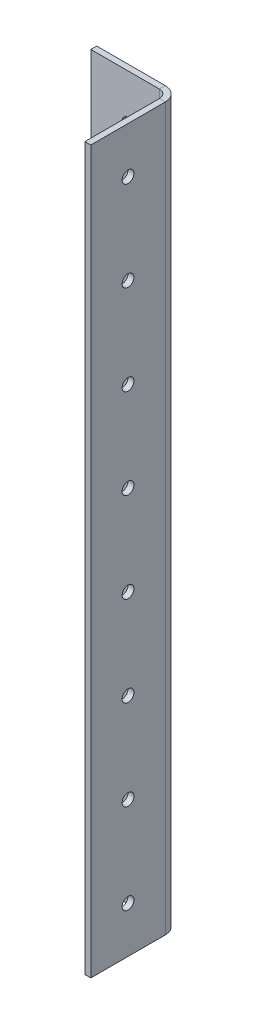
ISO-10303-21;
HEADER;
FILE_DESCRIPTION(('STEP AP214'),'2;1');
FILE_NAME('part.step','',(''),(''),'','','');
FILE_SCHEMA(('AUTOMOTIVE_DESIGN { 1 0 10303 214 1 1 1 1 }'));
ENDSEC;
DATA;
#1=APPLICATION_CONTEXT('core data for automotive mechanical design processes');
#2=APPLICATION_PROTOCOL_DEFINITION('international standard','automotive_design',2000,#1);
#3=PRODUCT_CONTEXT('',#1,'mechanical');
#4=PRODUCT('Part','Part','',(#3));
#5=PRODUCT_RELATED_PRODUCT_CATEGORY('part','',(#4));
#6=PRODUCT_DEFINITION_FORMATION('','',#4);
#7=PRODUCT_DEFINITION_CONTEXT('part definition',#1,'design');
#8=PRODUCT_DEFINITION('design','',#6,#7);
#9=PRODUCT_DEFINITION_SHAPE('','',#8);
#10=(LENGTH_UNIT() NAMED_UNIT(*) SI_UNIT(.MILLI.,.METRE.));
#11=(NAMED_UNIT(*) PLANE_ANGLE_UNIT() SI_UNIT($,.RADIAN.));
#12=(NAMED_UNIT(*) SI_UNIT($,.STERADIAN.) SOLID_ANGLE_UNIT());
#13=UNCERTAINTY_MEASURE_WITH_UNIT(LENGTH_MEASURE(1.E-05),#10,'distance_accuracy_value','');
#14=(GEOMETRIC_REPRESENTATION_CONTEXT(3) GLOBAL_UNCERTAINTY_ASSIGNED_CONTEXT((#13)) GLOBAL_UNIT_ASSIGNED_CONTEXT((#10,
#11,#12)) REPRESENTATION_CONTEXT('',''));
#15=CARTESIAN_POINT('',(0.,0.,0.));
#16=DIRECTION('',(0.,0.,1.));
#17=DIRECTION('',(1.,0.,0.));
#18=AXIS2_PLACEMENT_3D('',#15,#16,#17);
#19=CARTESIAN_POINT('',(-70.,610.,-10.));
#20=DIRECTION('',(0.,1.,0.));
#21=DIRECTION('',(0.,0.,1.));
#22=AXIS2_PLACEMENT_3D('',#19,#20,#21);
#23=PLANE('',#22);
#24=DIRECTION('',(-1.,0.,0.));
#25=VECTOR('',#24,1.);
#26=CARTESIAN_POINT('',(-70.,610.,0.));
#27=LINE('',#26,#25);
#28=CARTESIAN_POINT('',(46.0000000000001,610.,0.));
#29=VERTEX_POINT('',#28);
#30=CARTESIAN_POINT('',(-70.,610.,0.));
#31=VERTEX_POINT('',#30);
#32=EDGE_CURVE('E109',#29,#31,#27,.T.);
#33=ORIENTED_EDGE('',*,*,#32,.F.);
#34=DIRECTION('',(0.,0.,-1.));
#35=VECTOR('',#34,1.);
#36=CARTESIAN_POINT('',(46.0000000000001,610.,0.));
#37=LINE('',#36,#35);
#38=CARTESIAN_POINT('',(46.0000000000001,610.,-10.));
#39=VERTEX_POINT('',#38);
#40=EDGE_CURVE('E129',#29,#39,#37,.T.);
#41=ORIENTED_EDGE('',*,*,#40,.T.);
#42=DIRECTION('',(-1.,0.,0.));
#43=VECTOR('',#42,1.);
#44=CARTESIAN_POINT('',(-70.,610.,-10.));
#45=LINE('',#44,#43);
#46=CARTESIAN_POINT('',(-70.,610.,-10.));
#47=VERTEX_POINT('',#46);
#48=EDGE_CURVE('E116',#39,#47,#45,.T.);
#49=ORIENTED_EDGE('',*,*,#48,.T.);
#50=DIRECTION('',(0.,0.,1.));
#51=VECTOR('',#50,1.);
#52=CARTESIAN_POINT('',(-70.,610.,-10.));
#53=LINE('',#52,#51);
#54=EDGE_CURVE('E63',#47,#31,#53,.T.);
#55=ORIENTED_EDGE('',*,*,#54,.T.);
#56=EDGE_LOOP('',(#33,#41,#49,#55));
#57=FACE_BOUND('',#56,.T.);
#58=ADVANCED_FACE('F60',(#57),#23,.T.);
#59=CARTESIAN_POINT('',(0.,0.,-10.));
#60=DIRECTION('',(0.,0.,-1.));
#61=DIRECTION('',(-1.,0.,0.));
#62=AXIS2_PLACEMENT_3D('',#59,#60,#61);
#63=PLANE('',#62);
#64=CARTESIAN_POINT('',(-7.00000000000001,380.,-10.));
#65=DIRECTION('',(0.,0.,1.));
#66=DIRECTION('',(1.,0.,0.));
#67=AXIS2_PLACEMENT_3D('',#64,#65,#66);
#68=CIRCLE('',#67,10.);
#69=CARTESIAN_POINT('',(3.00000000000001,380.,-10.));
#70=VERTEX_POINT('',#69);
#71=EDGE_CURVE('E230',#70,#70,#68,.T.);
#72=ORIENTED_EDGE('',*,*,#71,.T.);
#73=EDGE_LOOP('',(#72));
#74=FACE_BOUND('',#73,.T.);
#75=CARTESIAN_POINT('',(-7.00000000000001,228.,-10.));
#76=DIRECTION('',(0.,0.,1.));
#77=DIRECTION('',(1.,0.,0.));
#78=AXIS2_PLACEMENT_3D('',#75,#76,#77);
#79=CIRCLE('',#78,10.);
#80=CARTESIAN_POINT('',(3.00000000000001,228.,-10.));
#81=VERTEX_POINT('',#80);
#82=EDGE_CURVE('E321',#81,#81,#79,.T.);
#83=ORIENTED_EDGE('',*,*,#82,.T.);
#84=EDGE_LOOP('',(#83));
#85=FACE_BOUND('',#84,.T.);
#86=CARTESIAN_POINT('',(-7.00000000000001,76.,-10.));
#87=DIRECTION('',(0.,0.,1.));
#88=DIRECTION('',(1.,0.,0.));
#89=AXIS2_PLACEMENT_3D('',#86,#87,#88);
#90=CIRCLE('',#89,10.);
#91=CARTESIAN_POINT('',(3.00000000000001,76.,-10.));
#92=VERTEX_POINT('',#91);
#93=EDGE_CURVE('E313',#92,#92,#90,.T.);
#94=ORIENTED_EDGE('',*,*,#93,.T.);
#95=EDGE_LOOP('',(#94));
#96=FACE_BOUND('',#95,.T.);
#97=CARTESIAN_POINT('',(-7.00000000000001,-76.0000000000001,-10.));
#98=DIRECTION('',(0.,0.,1.));
#99=DIRECTION('',(1.,0.,0.));
#100=AXIS2_PLACEMENT_3D('',#97,#98,#99);
#101=CIRCLE('',#100,10.);
#102=CARTESIAN_POINT('',(3.00000000000001,-76.0000000000001,-10.));
#103=VERTEX_POINT('',#102);
#104=EDGE_CURVE('E305',#103,#103,#101,.T.);
#105=ORIENTED_EDGE('',*,*,#104,.T.);
#106=EDGE_LOOP('',(#105));
#107=FACE_BOUND('',#106,.T.);
#108=CARTESIAN_POINT('',(-7.00000000000001,-228.,-10.));
#109=DIRECTION('',(0.,0.,1.));
#110=DIRECTION('',(1.,0.,0.));
#111=AXIS2_PLACEMENT_3D('',#108,#109,#110);
#112=CIRCLE('',#111,10.);
#113=CARTESIAN_POINT('',(3.00000000000001,-228.,-10.));
#114=VERTEX_POINT('',#113);
#115=EDGE_CURVE('E297',#114,#114,#112,.T.);
#116=ORIENTED_EDGE('',*,*,#115,.T.);
#117=EDGE_LOOP('',(#116));
#118=FACE_BOUND('',#117,.T.);
#119=CARTESIAN_POINT('',(-7.00000000000001,-380.,-10.));
#120=DIRECTION('',(0.,0.,1.));
#121=DIRECTION('',(1.,0.,0.));
#122=AXIS2_PLACEMENT_3D('',#119,#120,#121);
#123=CIRCLE('',#122,10.);
#124=CARTESIAN_POINT('',(3.00000000000001,-380.,-10.));
#125=VERTEX_POINT('',#124);
#126=EDGE_CURVE('E289',#125,#125,#123,.T.);
#127=ORIENTED_EDGE('',*,*,#126,.T.);
#128=EDGE_LOOP('',(#127));
#129=FACE_BOUND('',#128,.T.);
#130=CARTESIAN_POINT('',(-7.00000000000001,-532.,-10.));
#131=DIRECTION('',(0.,0.,1.));
#132=DIRECTION('',(1.,0.,0.));
#133=AXIS2_PLACEMENT_3D('',#130,#131,#132);
#134=CIRCLE('',#133,10.);
#135=CARTESIAN_POINT('',(3.00000000000001,-532.,-10.));
#136=VERTEX_POINT('',#135);
#137=EDGE_CURVE('E281',#136,#136,#134,.T.);
#138=ORIENTED_EDGE('',*,*,#137,.T.);
#139=EDGE_LOOP('',(#138));
#140=FACE_BOUND('',#139,.T.);
#141=CARTESIAN_POINT('',(-7.00000000000001,532.,-10.));
#142=DIRECTION('',(0.,0.,1.));
#143=DIRECTION('',(1.,0.,0.));
#144=AXIS2_PLACEMENT_3D('',#141,#142,#143);
#145=CIRCLE('',#144,10.);
#146=CARTESIAN_POINT('',(3.00000000000001,532.,-10.));
#147=VERTEX_POINT('',#146);
#148=EDGE_CURVE('E209',#147,#147,#145,.T.);
#149=ORIENTED_EDGE('',*,*,#148,.T.);
#150=EDGE_LOOP('',(#149));
#151=FACE_BOUND('',#150,.T.);
#152=ORIENTED_EDGE('',*,*,#48,.F.);
#153=DIRECTION('',(0.,1.,0.));
#154=VECTOR('',#153,1.);
#155=CARTESIAN_POINT('',(46.0000000000001,610.,-10.));
#156=LINE('',#155,#154);
#157=CARTESIAN_POINT('',(46.0000000000001,-610.,-10.));
#158=VERTEX_POINT('',#157);
#159=EDGE_CURVE('E152',#39,#158,#156,.F.);
#160=ORIENTED_EDGE('',*,*,#159,.T.);
#161=DIRECTION('',(1.,0.,0.));
#162=VECTOR('',#161,1.);
#163=CARTESIAN_POINT('',(-70.,-610.,-10.));
#164=LINE('',#163,#162);
#165=CARTESIAN_POINT('',(-70.,-610.,-10.));
#166=VERTEX_POINT('',#165);
#167=EDGE_CURVE('E124',#166,#158,#164,.T.);
#168=ORIENTED_EDGE('',*,*,#167,.F.);
#169=DIRECTION('',(0.,-1.,0.));
#170=VECTOR('',#169,1.);
#171=CARTESIAN_POINT('',(-70.,-610.,-10.));
#172=LINE('',#171,#170);
#173=EDGE_CURVE('E99',#47,#166,#172,.T.);
#174=ORIENTED_EDGE('',*,*,#173,.F.);
#175=EDGE_LOOP('',(#152,#160,#168,#174));
#176=FACE_BOUND('',#175,.T.);
#177=ADVANCED_FACE('F334',(#74,#85,#96,#107,#118,#129,#140,#151,#176),#63,.T.);
#178=CARTESIAN_POINT('',(0.,0.,0.));
#179=DIRECTION('',(0.,0.,-1.));
#180=DIRECTION('',(-1.,0.,0.));
#181=AXIS2_PLACEMENT_3D('',#178,#179,#180);
#182=PLANE('',#181);
#183=CARTESIAN_POINT('',(-7.00000000000001,380.,0.));
#184=DIRECTION('',(0.,0.,1.));
#185=DIRECTION('',(1.,0.,0.));
#186=AXIS2_PLACEMENT_3D('',#183,#184,#185);
#187=CIRCLE('',#186,10.);
#188=CARTESIAN_POINT('',(3.00000000000001,380.,0.));
#189=VERTEX_POINT('',#188);
#190=EDGE_CURVE('E325',#189,#189,#187,.T.);
#191=ORIENTED_EDGE('',*,*,#190,.F.);
#192=EDGE_LOOP('',(#191));
#193=FACE_BOUND('',#192,.T.);
#194=CARTESIAN_POINT('',(-7.00000000000001,228.,0.));
#195=DIRECTION('',(0.,0.,1.));
#196=DIRECTION('',(1.,0.,0.));
#197=AXIS2_PLACEMENT_3D('',#194,#195,#196);
#198=CIRCLE('',#197,10.);
#199=CARTESIAN_POINT('',(3.00000000000001,228.,0.));
#200=VERTEX_POINT('',#199);
#201=EDGE_CURVE('E317',#200,#200,#198,.T.);
#202=ORIENTED_EDGE('',*,*,#201,.F.);
#203=EDGE_LOOP('',(#202));
#204=FACE_BOUND('',#203,.T.);
#205=CARTESIAN_POINT('',(-7.00000000000001,76.,0.));
#206=DIRECTION('',(0.,0.,1.));
#207=DIRECTION('',(1.,0.,0.));
#208=AXIS2_PLACEMENT_3D('',#205,#206,#207);
#209=CIRCLE('',#208,10.);
#210=CARTESIAN_POINT('',(3.00000000000001,76.,0.));
#211=VERTEX_POINT('',#210);
#212=EDGE_CURVE('E309',#211,#211,#209,.T.);
#213=ORIENTED_EDGE('',*,*,#212,.F.);
#214=EDGE_LOOP('',(#213));
#215=FACE_BOUND('',#214,.T.);
#216=CARTESIAN_POINT('',(-7.00000000000001,-76.0000000000001,0.));
#217=DIRECTION('',(0.,0.,1.));
#218=DIRECTION('',(1.,0.,0.));
#219=AXIS2_PLACEMENT_3D('',#216,#217,#218);
#220=CIRCLE('',#219,10.);
#221=CARTESIAN_POINT('',(3.00000000000001,-76.0000000000001,0.));
#222=VERTEX_POINT('',#221);
#223=EDGE_CURVE('E301',#222,#222,#220,.T.);
#224=ORIENTED_EDGE('',*,*,#223,.F.);
#225=EDGE_LOOP('',(#224));
#226=FACE_BOUND('',#225,.T.);
#227=CARTESIAN_POINT('',(-7.00000000000001,-228.,0.));
#228=DIRECTION('',(0.,0.,1.));
#229=DIRECTION('',(1.,0.,0.));
#230=AXIS2_PLACEMENT_3D('',#227,#228,#229);
#231=CIRCLE('',#230,10.);
#232=CARTESIAN_POINT('',(3.00000000000001,-228.,0.));
#233=VERTEX_POINT('',#232);
#234=EDGE_CURVE('E293',#233,#233,#231,.T.);
#235=ORIENTED_EDGE('',*,*,#234,.F.);
#236=EDGE_LOOP('',(#235));
#237=FACE_BOUND('',#236,.T.);
#238=CARTESIAN_POINT('',(-7.00000000000001,-380.,0.));
#239=DIRECTION('',(0.,0.,1.));
#240=DIRECTION('',(1.,0.,0.));
#241=AXIS2_PLACEMENT_3D('',#238,#239,#240);
#242=CIRCLE('',#241,10.);
#243=CARTESIAN_POINT('',(3.00000000000001,-380.,0.));
#244=VERTEX_POINT('',#243);
#245=EDGE_CURVE('E285',#244,#244,#242,.T.);
#246=ORIENTED_EDGE('',*,*,#245,.F.);
#247=EDGE_LOOP('',(#246));
#248=FACE_BOUND('',#247,.T.);
#249=CARTESIAN_POINT('',(-7.00000000000001,-532.,0.));
#250=DIRECTION('',(0.,0.,1.));
#251=DIRECTION('',(1.,0.,0.));
#252=AXIS2_PLACEMENT_3D('',#249,#250,#251);
#253=CIRCLE('',#252,10.);
#254=CARTESIAN_POINT('',(3.00000000000001,-532.,0.));
#255=VERTEX_POINT('',#254);
#256=EDGE_CURVE('E277',#255,#255,#253,.T.);
#257=ORIENTED_EDGE('',*,*,#256,.F.);
#258=EDGE_LOOP('',(#257));
#259=FACE_BOUND('',#258,.T.);
#260=CARTESIAN_POINT('',(-7.00000000000001,532.,0.));
#261=DIRECTION('',(0.,0.,1.));
#262=DIRECTION('',(1.,0.,0.));
#263=AXIS2_PLACEMENT_3D('',#260,#261,#262);
#264=CIRCLE('',#263,10.);
#265=CARTESIAN_POINT('',(3.00000000000001,532.,0.));
#266=VERTEX_POINT('',#265);
#267=EDGE_CURVE('E213',#266,#266,#264,.T.);
#268=ORIENTED_EDGE('',*,*,#267,.F.);
#269=EDGE_LOOP('',(#268));
#270=FACE_BOUND('',#269,.T.);
#271=DIRECTION('',(0.,1.,0.));
#272=VECTOR('',#271,1.);
#273=CARTESIAN_POINT('',(46.0000000000001,610.,0.));
#274=LINE('',#273,#272);
#275=CARTESIAN_POINT('',(46.0000000000001,-610.,0.));
#276=VERTEX_POINT('',#275);
#277=EDGE_CURVE('E139',#29,#276,#274,.F.);
#278=ORIENTED_EDGE('',*,*,#277,.F.);
#279=ORIENTED_EDGE('',*,*,#32,.T.);
#280=DIRECTION('',(0.,-1.,0.));
#281=VECTOR('',#280,1.);
#282=CARTESIAN_POINT('',(-70.,-610.,0.));
#283=LINE('',#282,#281);
#284=CARTESIAN_POINT('',(-70.,-610.,0.));
#285=VERTEX_POINT('',#284);
#286=EDGE_CURVE('E97',#31,#285,#283,.T.);
#287=ORIENTED_EDGE('',*,*,#286,.T.);
#288=DIRECTION('',(1.,0.,0.));
#289=VECTOR('',#288,1.);
#290=CARTESIAN_POINT('',(-70.,-610.,0.));
#291=LINE('',#290,#289);
#292=EDGE_CURVE('E106',#285,#276,#291,.T.);
#293=ORIENTED_EDGE('',*,*,#292,.T.);
#294=EDGE_LOOP('',(#278,#279,#287,#293));
#295=FACE_BOUND('',#294,.T.);
#296=ADVANCED_FACE('F104',(#193,#204,#215,#226,#237,#248,#259,#270,#295),#182,.F.);
#297=CARTESIAN_POINT('',(-70.,-610.,-10.));
#298=DIRECTION('',(0.,-1.,0.));
#299=DIRECTION('',(0.,0.,-1.));
#300=AXIS2_PLACEMENT_3D('',#297,#298,#299);
#301=PLANE('',#300);
#302=DIRECTION('',(0.,0.,-1.));
#303=VECTOR('',#302,1.);
#304=CARTESIAN_POINT('',(46.0000000000001,-610.,0.));
#305=LINE('',#304,#303);
#306=EDGE_CURVE('E114',#276,#158,#305,.T.);
#307=ORIENTED_EDGE('',*,*,#306,.F.);
#308=ORIENTED_EDGE('',*,*,#292,.F.);
#309=DIRECTION('',(0.,0.,1.));
#310=VECTOR('',#309,1.);
#311=CARTESIAN_POINT('',(-70.,-610.,-10.));
#312=LINE('',#311,#310);
#313=EDGE_CURVE('E13',#166,#285,#312,.T.);
#314=ORIENTED_EDGE('',*,*,#313,.F.);
#315=ORIENTED_EDGE('',*,*,#167,.T.);
#316=EDGE_LOOP('',(#307,#308,#314,#315));
#317=FACE_BOUND('',#316,.T.);
#318=ADVANCED_FACE('F113',(#317),#301,.T.);
#319=CARTESIAN_POINT('',(-70.,-610.,-10.));
#320=DIRECTION('',(-1.,0.,0.));
#321=DIRECTION('',(0.,0.,1.));
#322=AXIS2_PLACEMENT_3D('',#319,#320,#321);
#323=PLANE('',#322);
#324=ORIENTED_EDGE('',*,*,#286,.F.);
#325=ORIENTED_EDGE('',*,*,#54,.F.);
#326=ORIENTED_EDGE('',*,*,#173,.T.);
#327=ORIENTED_EDGE('',*,*,#313,.T.);
#328=EDGE_LOOP('',(#324,#325,#326,#327));
#329=FACE_BOUND('',#328,.T.);
#330=ADVANCED_FACE('F95',(#329),#323,.T.);
#331=CARTESIAN_POINT('',(46.0000000000001,-610.,14.));
#332=DIRECTION('',(0.,-1.,0.));
#333=DIRECTION('',(0.,0.,-1.));
#334=AXIS2_PLACEMENT_3D('',#331,#332,#333);
#335=PLANE('',#334);
#336=DIRECTION('',(-1.,0.,0.));
#337=VECTOR('',#336,1.);
#338=CARTESIAN_POINT('',(70.0000000000001,-610.,13.9999999999999));
#339=LINE('',#338,#337);
#340=CARTESIAN_POINT('',(60.0000000000001,-610.,13.9999999999999));
#341=VERTEX_POINT('',#340);
#342=CARTESIAN_POINT('',(70.0000000000001,-610.,13.9999999999999));
#343=VERTEX_POINT('',#342);
#344=EDGE_CURVE('E158',#341,#343,#339,.F.);
#345=ORIENTED_EDGE('',*,*,#344,.F.);
#346=CARTESIAN_POINT('',(46.0000000000001,-610.,14.));
#347=DIRECTION('',(0.,1.,0.));
#348=DIRECTION('',(0.,0.,1.));
#349=AXIS2_PLACEMENT_3D('',#346,#347,#348);
#350=CIRCLE('',#349,14.);
#351=EDGE_CURVE('E144',#276,#341,#350,.F.);
#352=ORIENTED_EDGE('',*,*,#351,.F.);
#353=ORIENTED_EDGE('',*,*,#306,.T.);
#354=CARTESIAN_POINT('',(46.0000000000001,-610.,14.));
#355=DIRECTION('',(0.,1.,0.));
#356=DIRECTION('',(0.,0.,1.));
#357=AXIS2_PLACEMENT_3D('',#354,#355,#356);
#358=CIRCLE('',#357,24.);
#359=EDGE_CURVE('E75',#158,#343,#358,.F.);
#360=ORIENTED_EDGE('',*,*,#359,.T.);
#361=EDGE_LOOP('',(#345,#352,#353,#360));
#362=FACE_BOUND('',#361,.T.);
#363=ADVANCED_FACE('F436',(#362),#335,.T.);
#364=CARTESIAN_POINT('',(46.0000000000001,610.,14.));
#365=DIRECTION('',(0.,-1.,0.));
#366=DIRECTION('',(0.,0.,-1.));
#367=AXIS2_PLACEMENT_3D('',#364,#365,#366);
#368=PLANE('',#367);
#369=CARTESIAN_POINT('',(46.0000000000001,610.,14.));
#370=DIRECTION('',(0.,1.,0.));
#371=DIRECTION('',(0.,0.,1.));
#372=AXIS2_PLACEMENT_3D('',#369,#370,#371);
#373=CIRCLE('',#372,14.);
#374=CARTESIAN_POINT('',(60.0000000000001,610.,13.9999999999999));
#375=VERTEX_POINT('',#374);
#376=EDGE_CURVE('E135',#375,#29,#373,.T.);
#377=ORIENTED_EDGE('',*,*,#376,.F.);
#378=DIRECTION('',(-1.,0.,0.));
#379=VECTOR('',#378,1.);
#380=CARTESIAN_POINT('',(60.0000000000001,610.,13.9999999999999));
#381=LINE('',#380,#379);
#382=CARTESIAN_POINT('',(70.0000000000001,610.,13.9999999999999));
#383=VERTEX_POINT('',#382);
#384=EDGE_CURVE('E167',#375,#383,#381,.F.);
#385=ORIENTED_EDGE('',*,*,#384,.T.);
#386=CARTESIAN_POINT('',(46.0000000000001,610.,14.));
#387=DIRECTION('',(0.,1.,0.));
#388=DIRECTION('',(0.,0.,1.));
#389=AXIS2_PLACEMENT_3D('',#386,#387,#388);
#390=CIRCLE('',#389,24.);
#391=EDGE_CURVE('E148',#383,#39,#390,.T.);
#392=ORIENTED_EDGE('',*,*,#391,.T.);
#393=ORIENTED_EDGE('',*,*,#40,.F.);
#394=EDGE_LOOP('',(#377,#385,#392,#393));
#395=FACE_BOUND('',#394,.T.);
#396=ADVANCED_FACE('F416',(#395),#368,.F.);
#397=CARTESIAN_POINT('',(46.0000000000001,610.,14.));
#398=DIRECTION('',(0.,1.,0.));
#399=DIRECTION('',(1.,0.,0.));
#400=AXIS2_PLACEMENT_3D('',#397,#398,#399);
#401=CYLINDRICAL_SURFACE('',#400,24.);
#402=ORIENTED_EDGE('',*,*,#159,.F.);
#403=ORIENTED_EDGE('',*,*,#391,.F.);
#404=DIRECTION('',(0.,1.,0.));
#405=VECTOR('',#404,1.);
#406=CARTESIAN_POINT('',(70.0000000000001,-610.,13.9999999999999));
#407=LINE('',#406,#405);
#408=EDGE_CURVE('E171',#383,#343,#407,.F.);
#409=ORIENTED_EDGE('',*,*,#408,.T.);
#410=ORIENTED_EDGE('',*,*,#359,.F.);
#411=EDGE_LOOP('',(#402,#403,#409,#410));
#412=FACE_BOUND('',#411,.T.);
#413=ADVANCED_FACE('F414',(#412),#401,.T.);
#414=CARTESIAN_POINT('',(46.0000000000001,610.,14.));
#415=DIRECTION('',(0.,1.,0.));
#416=DIRECTION('',(1.,0.,0.));
#417=AXIS2_PLACEMENT_3D('',#414,#415,#416);
#418=CYLINDRICAL_SURFACE('',#417,14.);
#419=ORIENTED_EDGE('',*,*,#277,.T.);
#420=ORIENTED_EDGE('',*,*,#351,.T.);
#421=DIRECTION('',(0.,1.,0.));
#422=VECTOR('',#421,1.);
#423=CARTESIAN_POINT('',(60.0000000000001,-610.,14.));
#424=LINE('',#423,#422);
#425=EDGE_CURVE('E162',#341,#375,#424,.T.);
#426=ORIENTED_EDGE('',*,*,#425,.T.);
#427=ORIENTED_EDGE('',*,*,#376,.T.);
#428=EDGE_LOOP('',(#419,#420,#426,#427));
#429=FACE_BOUND('',#428,.T.);
#430=ADVANCED_FACE('F435',(#429),#418,.F.);
#431=CARTESIAN_POINT('',(70.0000000000005,610.,140.));
#432=DIRECTION('',(0.,-1.,0.));
#433=DIRECTION('',(0.,0.,-1.));
#434=AXIS2_PLACEMENT_3D('',#431,#432,#433);
#435=PLANE('',#434);
#436=ORIENTED_EDGE('',*,*,#384,.F.);
#437=DIRECTION('',(0.,0.,-1.));
#438=VECTOR('',#437,1.);
#439=CARTESIAN_POINT('',(60.0000000000005,610.,140.));
#440=LINE('',#439,#438);
#441=CARTESIAN_POINT('',(60.0000000000005,610.,140.));
#442=VERTEX_POINT('',#441);
#443=EDGE_CURVE('E174',#375,#442,#440,.F.);
#444=ORIENTED_EDGE('',*,*,#443,.T.);
#445=DIRECTION('',(-1.,0.,0.));
#446=VECTOR('',#445,1.);
#447=CARTESIAN_POINT('',(70.0000000000005,610.,140.));
#448=LINE('',#447,#446);
#449=CARTESIAN_POINT('',(70.0000000000005,610.,140.));
#450=VERTEX_POINT('',#449);
#451=EDGE_CURVE('E140',#450,#442,#448,.T.);
#452=ORIENTED_EDGE('',*,*,#451,.F.);
#453=DIRECTION('',(0.,0.,1.));
#454=VECTOR('',#453,1.);
#455=CARTESIAN_POINT('',(70.,610.,2.05963932132919E-13));
#456=LINE('',#455,#454);
#457=EDGE_CURVE('E186',#383,#450,#456,.T.);
#458=ORIENTED_EDGE('',*,*,#457,.F.);
#459=EDGE_LOOP('',(#436,#444,#452,#458));
#460=FACE_BOUND('',#459,.T.);
#461=ADVANCED_FACE('F425',(#460),#435,.F.);
#462=CARTESIAN_POINT('',(70.,-610.,0.));
#463=DIRECTION('',(0.,1.,0.));
#464=DIRECTION('',(0.,0.,1.));
#465=AXIS2_PLACEMENT_3D('',#462,#463,#464);
#466=PLANE('',#465);
#467=ORIENTED_EDGE('',*,*,#344,.T.);
#468=DIRECTION('',(0.,0.,-1.));
#469=VECTOR('',#468,1.);
#470=CARTESIAN_POINT('',(70.,-610.,-2.77776100025184E-13));
#471=LINE('',#470,#469);
#472=CARTESIAN_POINT('',(70.0000000000005,-610.,140.));
#473=VERTEX_POINT('',#472);
#474=EDGE_CURVE('E194',#473,#343,#471,.T.);
#475=ORIENTED_EDGE('',*,*,#474,.F.);
#476=DIRECTION('',(-1.,0.,0.));
#477=VECTOR('',#476,1.);
#478=CARTESIAN_POINT('',(70.0000000000005,-610.,140.));
#479=LINE('',#478,#477);
#480=CARTESIAN_POINT('',(60.0000000000005,-610.,140.));
#481=VERTEX_POINT('',#480);
#482=EDGE_CURVE('E198',#473,#481,#479,.T.);
#483=ORIENTED_EDGE('',*,*,#482,.T.);
#484=DIRECTION('',(0.,0.,1.));
#485=VECTOR('',#484,1.);
#486=CARTESIAN_POINT('',(60.,-610.,0.));
#487=LINE('',#486,#485);
#488=EDGE_CURVE('E182',#481,#341,#487,.F.);
#489=ORIENTED_EDGE('',*,*,#488,.T.);
#490=EDGE_LOOP('',(#467,#475,#483,#489));
#491=FACE_BOUND('',#490,.T.);
#492=ADVANCED_FACE('F430',(#491),#466,.F.);
#493=CARTESIAN_POINT('',(70.,0.,-2.77776100025184E-13));
#494=DIRECTION('',(-1.,0.,0.));
#495=DIRECTION('',(0.,0.,1.));
#496=AXIS2_PLACEMENT_3D('',#493,#494,#495);
#497=PLANE('',#496);
#498=CARTESIAN_POINT('',(70.0000000000003,380.,77.));
#499=DIRECTION('',(-1.,0.,0.));
#500=DIRECTION('',(0.,0.,1.));
#501=AXIS2_PLACEMENT_3D('',#498,#499,#500);
#502=CIRCLE('',#501,10.);
#503=CARTESIAN_POINT('',(70.0000000000003,380.,87.));
#504=VERTEX_POINT('',#503);
#505=EDGE_CURVE('E267',#504,#504,#502,.T.);
#506=ORIENTED_EDGE('',*,*,#505,.T.);
#507=EDGE_LOOP('',(#506));
#508=FACE_BOUND('',#507,.T.);
#509=CARTESIAN_POINT('',(70.0000000000003,228.,77.));
#510=DIRECTION('',(-1.,0.,0.));
#511=DIRECTION('',(0.,0.,1.));
#512=AXIS2_PLACEMENT_3D('',#509,#510,#511);
#513=CIRCLE('',#512,10.);
#514=CARTESIAN_POINT('',(70.0000000000003,228.,87.));
#515=VERTEX_POINT('',#514);
#516=EDGE_CURVE('E259',#515,#515,#513,.T.);
#517=ORIENTED_EDGE('',*,*,#516,.T.);
#518=EDGE_LOOP('',(#517));
#519=FACE_BOUND('',#518,.T.);
#520=CARTESIAN_POINT('',(70.0000000000003,76.,77.));
#521=DIRECTION('',(-1.,0.,0.));
#522=DIRECTION('',(0.,0.,1.));
#523=AXIS2_PLACEMENT_3D('',#520,#521,#522);
#524=CIRCLE('',#523,10.);
#525=CARTESIAN_POINT('',(70.0000000000003,76.,87.));
#526=VERTEX_POINT('',#525);
#527=EDGE_CURVE('E251',#526,#526,#524,.T.);
#528=ORIENTED_EDGE('',*,*,#527,.T.);
#529=EDGE_LOOP('',(#528));
#530=FACE_BOUND('',#529,.T.);
#531=CARTESIAN_POINT('',(70.0000000000003,-76.0000000000001,77.));
#532=DIRECTION('',(-1.,0.,0.));
#533=DIRECTION('',(0.,0.,1.));
#534=AXIS2_PLACEMENT_3D('',#531,#532,#533);
#535=CIRCLE('',#534,10.);
#536=CARTESIAN_POINT('',(70.0000000000003,-76.0000000000001,87.));
#537=VERTEX_POINT('',#536);
#538=EDGE_CURVE('E243',#537,#537,#535,.T.);
#539=ORIENTED_EDGE('',*,*,#538,.T.);
#540=EDGE_LOOP('',(#539));
#541=FACE_BOUND('',#540,.T.);
#542=CARTESIAN_POINT('',(70.0000000000003,-228.,77.));
#543=DIRECTION('',(-1.,0.,0.));
#544=DIRECTION('',(0.,0.,1.));
#545=AXIS2_PLACEMENT_3D('',#542,#543,#544);
#546=CIRCLE('',#545,10.);
#547=CARTESIAN_POINT('',(70.0000000000003,-228.,87.));
#548=VERTEX_POINT('',#547);
#549=EDGE_CURVE('E235',#548,#548,#546,.T.);
#550=ORIENTED_EDGE('',*,*,#549,.T.);
#551=EDGE_LOOP('',(#550));
#552=FACE_BOUND('',#551,.T.);
#553=CARTESIAN_POINT('',(70.0000000000003,-380.,77.));
#554=DIRECTION('',(-1.,0.,0.));
#555=DIRECTION('',(0.,0.,1.));
#556=AXIS2_PLACEMENT_3D('',#553,#554,#555);
#557=CIRCLE('',#556,10.);
#558=CARTESIAN_POINT('',(70.0000000000003,-380.,87.));
#559=VERTEX_POINT('',#558);
#560=EDGE_CURVE('E225',#559,#559,#557,.T.);
#561=ORIENTED_EDGE('',*,*,#560,.T.);
#562=EDGE_LOOP('',(#561));
#563=FACE_BOUND('',#562,.T.);
#564=CARTESIAN_POINT('',(70.0000000000003,-532.,77.));
#565=DIRECTION('',(-1.,0.,0.));
#566=DIRECTION('',(0.,0.,1.));
#567=AXIS2_PLACEMENT_3D('',#564,#565,#566);
#568=CIRCLE('',#567,10.);
#569=CARTESIAN_POINT('',(70.0000000000003,-532.,87.));
#570=VERTEX_POINT('',#569);
#571=EDGE_CURVE('E226',#570,#570,#568,.T.);
#572=ORIENTED_EDGE('',*,*,#571,.T.);
#573=EDGE_LOOP('',(#572));
#574=FACE_BOUND('',#573,.T.);
#575=CARTESIAN_POINT('',(70.0000000000003,532.,77.));
#576=DIRECTION('',(-1.,0.,0.));
#577=DIRECTION('',(0.,0.,1.));
#578=AXIS2_PLACEMENT_3D('',#575,#576,#577);
#579=CIRCLE('',#578,10.);
#580=CARTESIAN_POINT('',(70.0000000000003,532.,87.));
#581=VERTEX_POINT('',#580);
#582=EDGE_CURVE('E163',#581,#581,#579,.T.);
#583=ORIENTED_EDGE('',*,*,#582,.T.);
#584=EDGE_LOOP('',(#583));
#585=FACE_BOUND('',#584,.T.);
#586=ORIENTED_EDGE('',*,*,#408,.F.);
#587=ORIENTED_EDGE('',*,*,#457,.T.);
#588=DIRECTION('',(0.,-1.,0.));
#589=VECTOR('',#588,1.);
#590=CARTESIAN_POINT('',(70.0000000000005,0.,140.));
#591=LINE('',#590,#589);
#592=EDGE_CURVE('E190',#450,#473,#591,.T.);
#593=ORIENTED_EDGE('',*,*,#592,.T.);
#594=ORIENTED_EDGE('',*,*,#474,.T.);
#595=EDGE_LOOP('',(#586,#587,#593,#594));
#596=FACE_BOUND('',#595,.T.);
#597=ADVANCED_FACE('F422',(#508,#519,#530,#541,#552,#563,#574,#585,#596),#497,.F.);
#598=CARTESIAN_POINT('',(60.,0.,-2.42861286636753E-13));
#599=DIRECTION('',(-1.,0.,0.));
#600=DIRECTION('',(0.,0.,1.));
#601=AXIS2_PLACEMENT_3D('',#598,#599,#600);
#602=PLANE('',#601);
#603=CARTESIAN_POINT('',(60.0000000000003,380.,77.));
#604=DIRECTION('',(-1.,0.,0.));
#605=DIRECTION('',(0.,0.,1.));
#606=AXIS2_PLACEMENT_3D('',#603,#604,#605);
#607=CIRCLE('',#606,10.);
#608=CARTESIAN_POINT('',(60.0000000000003,380.,87.));
#609=VERTEX_POINT('',#608);
#610=EDGE_CURVE('E217',#609,#609,#607,.T.);
#611=ORIENTED_EDGE('',*,*,#610,.F.);
#612=EDGE_LOOP('',(#611));
#613=FACE_BOUND('',#612,.T.);
#614=CARTESIAN_POINT('',(60.0000000000003,228.,77.));
#615=DIRECTION('',(-1.,0.,0.));
#616=DIRECTION('',(0.,0.,1.));
#617=AXIS2_PLACEMENT_3D('',#614,#615,#616);
#618=CIRCLE('',#617,10.);
#619=CARTESIAN_POINT('',(60.0000000000003,228.,87.));
#620=VERTEX_POINT('',#619);
#621=EDGE_CURVE('E263',#620,#620,#618,.T.);
#622=ORIENTED_EDGE('',*,*,#621,.F.);
#623=EDGE_LOOP('',(#622));
#624=FACE_BOUND('',#623,.T.);
#625=CARTESIAN_POINT('',(60.0000000000003,76.,77.));
#626=DIRECTION('',(-1.,0.,0.));
#627=DIRECTION('',(0.,0.,1.));
#628=AXIS2_PLACEMENT_3D('',#625,#626,#627);
#629=CIRCLE('',#628,10.);
#630=CARTESIAN_POINT('',(60.0000000000003,76.,87.));
#631=VERTEX_POINT('',#630);
#632=EDGE_CURVE('E255',#631,#631,#629,.T.);
#633=ORIENTED_EDGE('',*,*,#632,.F.);
#634=EDGE_LOOP('',(#633));
#635=FACE_BOUND('',#634,.T.);
#636=CARTESIAN_POINT('',(60.0000000000003,-76.0000000000001,77.));
#637=DIRECTION('',(-1.,0.,0.));
#638=DIRECTION('',(0.,0.,1.));
#639=AXIS2_PLACEMENT_3D('',#636,#637,#638);
#640=CIRCLE('',#639,10.);
#641=CARTESIAN_POINT('',(60.0000000000003,-76.0000000000001,87.));
#642=VERTEX_POINT('',#641);
#643=EDGE_CURVE('E247',#642,#642,#640,.T.);
#644=ORIENTED_EDGE('',*,*,#643,.F.);
#645=EDGE_LOOP('',(#644));
#646=FACE_BOUND('',#645,.T.);
#647=CARTESIAN_POINT('',(60.0000000000003,-228.,77.));
#648=DIRECTION('',(-1.,0.,0.));
#649=DIRECTION('',(0.,0.,1.));
#650=AXIS2_PLACEMENT_3D('',#647,#648,#649);
#651=CIRCLE('',#650,10.);
#652=CARTESIAN_POINT('',(60.0000000000003,-228.,87.));
#653=VERTEX_POINT('',#652);
#654=EDGE_CURVE('E239',#653,#653,#651,.T.);
#655=ORIENTED_EDGE('',*,*,#654,.F.);
#656=EDGE_LOOP('',(#655));
#657=FACE_BOUND('',#656,.T.);
#658=CARTESIAN_POINT('',(60.0000000000003,-380.,77.));
#659=DIRECTION('',(-1.,0.,0.));
#660=DIRECTION('',(0.,0.,1.));
#661=AXIS2_PLACEMENT_3D('',#658,#659,#660);
#662=CIRCLE('',#661,10.);
#663=CARTESIAN_POINT('',(60.0000000000003,-380.,87.));
#664=VERTEX_POINT('',#663);
#665=EDGE_CURVE('E231',#664,#664,#662,.T.);
#666=ORIENTED_EDGE('',*,*,#665,.F.);
#667=EDGE_LOOP('',(#666));
#668=FACE_BOUND('',#667,.T.);
#669=CARTESIAN_POINT('',(60.0000000000003,-532.,77.));
#670=DIRECTION('',(-1.,0.,0.));
#671=DIRECTION('',(0.,0.,1.));
#672=AXIS2_PLACEMENT_3D('',#669,#670,#671);
#673=CIRCLE('',#672,10.);
#674=CARTESIAN_POINT('',(60.0000000000003,-532.,87.));
#675=VERTEX_POINT('',#674);
#676=EDGE_CURVE('E221',#675,#675,#673,.T.);
#677=ORIENTED_EDGE('',*,*,#676,.F.);
#678=EDGE_LOOP('',(#677));
#679=FACE_BOUND('',#678,.T.);
#680=CARTESIAN_POINT('',(60.0000000000003,532.,77.));
#681=DIRECTION('',(-1.,0.,0.));
#682=DIRECTION('',(0.,0.,1.));
#683=AXIS2_PLACEMENT_3D('',#680,#681,#682);
#684=CIRCLE('',#683,10.);
#685=CARTESIAN_POINT('',(60.0000000000003,532.,87.));
#686=VERTEX_POINT('',#685);
#687=EDGE_CURVE('E205',#686,#686,#684,.T.);
#688=ORIENTED_EDGE('',*,*,#687,.F.);
#689=EDGE_LOOP('',(#688));
#690=FACE_BOUND('',#689,.T.);
#691=ORIENTED_EDGE('',*,*,#443,.F.);
#692=ORIENTED_EDGE('',*,*,#425,.F.);
#693=ORIENTED_EDGE('',*,*,#488,.F.);
#694=DIRECTION('',(0.,1.,0.));
#695=VECTOR('',#694,1.);
#696=CARTESIAN_POINT('',(60.0000000000005,-610.,140.));
#697=LINE('',#696,#695);
#698=EDGE_CURVE('E178',#442,#481,#697,.F.);
#699=ORIENTED_EDGE('',*,*,#698,.F.);
#700=EDGE_LOOP('',(#691,#692,#693,#699));
#701=FACE_BOUND('',#700,.T.);
#702=ADVANCED_FACE('F433',(#613,#624,#635,#646,#657,#668,#679,#690,#701),#602,.T.);
#703=CARTESIAN_POINT('',(70.0000000000005,-610.,140.));
#704=DIRECTION('',(0.,0.,-1.));
#705=DIRECTION('',(-1.,0.,0.));
#706=AXIS2_PLACEMENT_3D('',#703,#704,#705);
#707=PLANE('',#706);
#708=ORIENTED_EDGE('',*,*,#698,.T.);
#709=ORIENTED_EDGE('',*,*,#482,.F.);
#710=ORIENTED_EDGE('',*,*,#592,.F.);
#711=ORIENTED_EDGE('',*,*,#451,.T.);
#712=EDGE_LOOP('',(#708,#709,#710,#711));
#713=FACE_BOUND('',#712,.T.);
#714=ADVANCED_FACE('F374',(#713),#707,.F.);
#715=CARTESIAN_POINT('',(70.0000000000003,532.,77.));
#716=DIRECTION('',(-1.,0.,0.));
#717=DIRECTION('',(0.,0.,1.));
#718=AXIS2_PLACEMENT_3D('',#715,#716,#717);
#719=CYLINDRICAL_SURFACE('',#718,10.);
#720=ORIENTED_EDGE('',*,*,#582,.F.);
#721=EDGE_LOOP('',(#720));
#722=FACE_BOUND('',#721,.T.);
#723=ORIENTED_EDGE('',*,*,#687,.T.);
#724=EDGE_LOOP('',(#723));
#725=FACE_BOUND('',#724,.T.);
#726=ADVANCED_FACE('F364',(#722,#725),#719,.F.);
#727=CARTESIAN_POINT('',(-7.00000000000001,532.,-10.));
#728=DIRECTION('',(0.,0.,1.));
#729=DIRECTION('',(1.,0.,0.));
#730=AXIS2_PLACEMENT_3D('',#727,#728,#729);
#731=CYLINDRICAL_SURFACE('',#730,10.);
#732=ORIENTED_EDGE('',*,*,#148,.F.);
#733=EDGE_LOOP('',(#732));
#734=FACE_BOUND('',#733,.T.);
#735=ORIENTED_EDGE('',*,*,#267,.T.);
#736=EDGE_LOOP('',(#735));
#737=FACE_BOUND('',#736,.T.);
#738=ADVANCED_FACE('F361',(#734,#737),#731,.F.);
#739=CARTESIAN_POINT('',(70.0000000000003,-532.,77.));
#740=DIRECTION('',(-1.,0.,0.));
#741=DIRECTION('',(0.,0.,1.));
#742=AXIS2_PLACEMENT_3D('',#739,#740,#741);
#743=CYLINDRICAL_SURFACE('',#742,10.);
#744=ORIENTED_EDGE('',*,*,#571,.F.);
#745=EDGE_LOOP('',(#744));
#746=FACE_BOUND('',#745,.T.);
#747=ORIENTED_EDGE('',*,*,#676,.T.);
#748=EDGE_LOOP('',(#747));
#749=FACE_BOUND('',#748,.T.);
#750=ADVANCED_FACE('F363',(#746,#749),#743,.F.);
#751=CARTESIAN_POINT('',(70.0000000000003,-380.,77.));
#752=DIRECTION('',(-1.,0.,0.));
#753=DIRECTION('',(0.,0.,1.));
#754=AXIS2_PLACEMENT_3D('',#751,#752,#753);
#755=CYLINDRICAL_SURFACE('',#754,10.);
#756=ORIENTED_EDGE('',*,*,#560,.F.);
#757=EDGE_LOOP('',(#756));
#758=FACE_BOUND('',#757,.T.);
#759=ORIENTED_EDGE('',*,*,#665,.T.);
#760=EDGE_LOOP('',(#759));
#761=FACE_BOUND('',#760,.T.);
#762=ADVANCED_FACE('F371',(#758,#761),#755,.F.);
#763=CARTESIAN_POINT('',(70.0000000000003,-228.,77.));
#764=DIRECTION('',(-1.,0.,0.));
#765=DIRECTION('',(0.,0.,1.));
#766=AXIS2_PLACEMENT_3D('',#763,#764,#765);
#767=CYLINDRICAL_SURFACE('',#766,10.);
#768=ORIENTED_EDGE('',*,*,#549,.F.);
#769=EDGE_LOOP('',(#768));
#770=FACE_BOUND('',#769,.T.);
#771=ORIENTED_EDGE('',*,*,#654,.T.);
#772=EDGE_LOOP('',(#771));
#773=FACE_BOUND('',#772,.T.);
#774=ADVANCED_FACE('F550',(#770,#773),#767,.F.);
#775=CARTESIAN_POINT('',(70.0000000000003,-76.0000000000001,77.));
#776=DIRECTION('',(-1.,0.,0.));
#777=DIRECTION('',(0.,0.,1.));
#778=AXIS2_PLACEMENT_3D('',#775,#776,#777);
#779=CYLINDRICAL_SURFACE('',#778,10.);
#780=ORIENTED_EDGE('',*,*,#538,.F.);
#781=EDGE_LOOP('',(#780));
#782=FACE_BOUND('',#781,.T.);
#783=ORIENTED_EDGE('',*,*,#643,.T.);
#784=EDGE_LOOP('',(#783));
#785=FACE_BOUND('',#784,.T.);
#786=ADVANCED_FACE('F560',(#782,#785),#779,.F.);
#787=CARTESIAN_POINT('',(70.0000000000003,76.,77.));
#788=DIRECTION('',(-1.,0.,0.));
#789=DIRECTION('',(0.,0.,1.));
#790=AXIS2_PLACEMENT_3D('',#787,#788,#789);
#791=CYLINDRICAL_SURFACE('',#790,10.);
#792=ORIENTED_EDGE('',*,*,#527,.F.);
#793=EDGE_LOOP('',(#792));
#794=FACE_BOUND('',#793,.T.);
#795=ORIENTED_EDGE('',*,*,#632,.T.);
#796=EDGE_LOOP('',(#795));
#797=FACE_BOUND('',#796,.T.);
#798=ADVANCED_FACE('F570',(#794,#797),#791,.F.);
#799=CARTESIAN_POINT('',(70.0000000000003,228.,77.));
#800=DIRECTION('',(-1.,0.,0.));
#801=DIRECTION('',(0.,0.,1.));
#802=AXIS2_PLACEMENT_3D('',#799,#800,#801);
#803=CYLINDRICAL_SURFACE('',#802,10.);
#804=ORIENTED_EDGE('',*,*,#516,.F.);
#805=EDGE_LOOP('',(#804));
#806=FACE_BOUND('',#805,.T.);
#807=ORIENTED_EDGE('',*,*,#621,.T.);
#808=EDGE_LOOP('',(#807));
#809=FACE_BOUND('',#808,.T.);
#810=ADVANCED_FACE('F580',(#806,#809),#803,.F.);
#811=CARTESIAN_POINT('',(70.0000000000003,380.,77.));
#812=DIRECTION('',(-1.,0.,0.));
#813=DIRECTION('',(0.,0.,1.));
#814=AXIS2_PLACEMENT_3D('',#811,#812,#813);
#815=CYLINDRICAL_SURFACE('',#814,10.);
#816=ORIENTED_EDGE('',*,*,#505,.F.);
#817=EDGE_LOOP('',(#816));
#818=FACE_BOUND('',#817,.T.);
#819=ORIENTED_EDGE('',*,*,#610,.T.);
#820=EDGE_LOOP('',(#819));
#821=FACE_BOUND('',#820,.T.);
#822=ADVANCED_FACE('F590',(#818,#821),#815,.F.);
#823=CARTESIAN_POINT('',(-7.00000000000001,-532.,-10.));
#824=DIRECTION('',(0.,0.,1.));
#825=DIRECTION('',(1.,0.,0.));
#826=AXIS2_PLACEMENT_3D('',#823,#824,#825);
#827=CYLINDRICAL_SURFACE('',#826,10.);
#828=ORIENTED_EDGE('',*,*,#137,.F.);
#829=EDGE_LOOP('',(#828));
#830=FACE_BOUND('',#829,.T.);
#831=ORIENTED_EDGE('',*,*,#256,.T.);
#832=EDGE_LOOP('',(#831));
#833=FACE_BOUND('',#832,.T.);
#834=ADVANCED_FACE('F600',(#830,#833),#827,.F.);
#835=CARTESIAN_POINT('',(-7.00000000000001,-380.,-10.));
#836=DIRECTION('',(0.,0.,1.));
#837=DIRECTION('',(1.,0.,0.));
#838=AXIS2_PLACEMENT_3D('',#835,#836,#837);
#839=CYLINDRICAL_SURFACE('',#838,10.);
#840=ORIENTED_EDGE('',*,*,#126,.F.);
#841=EDGE_LOOP('',(#840));
#842=FACE_BOUND('',#841,.T.);
#843=ORIENTED_EDGE('',*,*,#245,.T.);
#844=EDGE_LOOP('',(#843));
#845=FACE_BOUND('',#844,.T.);
#846=ADVANCED_FACE('F610',(#842,#845),#839,.F.);
#847=CARTESIAN_POINT('',(-7.00000000000001,-228.,-10.));
#848=DIRECTION('',(0.,0.,1.));
#849=DIRECTION('',(1.,0.,0.));
#850=AXIS2_PLACEMENT_3D('',#847,#848,#849);
#851=CYLINDRICAL_SURFACE('',#850,10.);
#852=ORIENTED_EDGE('',*,*,#115,.F.);
#853=EDGE_LOOP('',(#852));
#854=FACE_BOUND('',#853,.T.);
#855=ORIENTED_EDGE('',*,*,#234,.T.);
#856=EDGE_LOOP('',(#855));
#857=FACE_BOUND('',#856,.T.);
#858=ADVANCED_FACE('F620',(#854,#857),#851,.F.);
#859=CARTESIAN_POINT('',(-7.00000000000001,-76.0000000000001,-10.));
#860=DIRECTION('',(0.,0.,1.));
#861=DIRECTION('',(1.,0.,0.));
#862=AXIS2_PLACEMENT_3D('',#859,#860,#861);
#863=CYLINDRICAL_SURFACE('',#862,10.);
#864=ORIENTED_EDGE('',*,*,#104,.F.);
#865=EDGE_LOOP('',(#864));
#866=FACE_BOUND('',#865,.T.);
#867=ORIENTED_EDGE('',*,*,#223,.T.);
#868=EDGE_LOOP('',(#867));
#869=FACE_BOUND('',#868,.T.);
#870=ADVANCED_FACE('F630',(#866,#869),#863,.F.);
#871=CARTESIAN_POINT('',(-7.00000000000001,76.,-10.));
#872=DIRECTION('',(0.,0.,1.));
#873=DIRECTION('',(1.,0.,0.));
#874=AXIS2_PLACEMENT_3D('',#871,#872,#873);
#875=CYLINDRICAL_SURFACE('',#874,10.);
#876=ORIENTED_EDGE('',*,*,#93,.F.);
#877=EDGE_LOOP('',(#876));
#878=FACE_BOUND('',#877,.T.);
#879=ORIENTED_EDGE('',*,*,#212,.T.);
#880=EDGE_LOOP('',(#879));
#881=FACE_BOUND('',#880,.T.);
#882=ADVANCED_FACE('F640',(#878,#881),#875,.F.);
#883=CARTESIAN_POINT('',(-7.00000000000001,228.,-10.));
#884=DIRECTION('',(0.,0.,1.));
#885=DIRECTION('',(1.,0.,0.));
#886=AXIS2_PLACEMENT_3D('',#883,#884,#885);
#887=CYLINDRICAL_SURFACE('',#886,10.);
#888=ORIENTED_EDGE('',*,*,#82,.F.);
#889=EDGE_LOOP('',(#888));
#890=FACE_BOUND('',#889,.T.);
#891=ORIENTED_EDGE('',*,*,#201,.T.);
#892=EDGE_LOOP('',(#891));
#893=FACE_BOUND('',#892,.T.);
#894=ADVANCED_FACE('F340',(#890,#893),#887,.F.);
#895=CARTESIAN_POINT('',(-7.00000000000001,380.,-10.));
#896=DIRECTION('',(0.,0.,1.));
#897=DIRECTION('',(1.,0.,0.));
#898=AXIS2_PLACEMENT_3D('',#895,#896,#897);
#899=CYLINDRICAL_SURFACE('',#898,10.);
#900=ORIENTED_EDGE('',*,*,#71,.F.);
#901=EDGE_LOOP('',(#900));
#902=FACE_BOUND('',#901,.T.);
#903=ORIENTED_EDGE('',*,*,#190,.T.);
#904=EDGE_LOOP('',(#903));
#905=FACE_BOUND('',#904,.T.);
#906=ADVANCED_FACE('F337',(#902,#905),#899,.F.);
#907=CLOSED_SHELL('',(#58,#177,#296,#318,#330,#363,#396,#413,#430,#461,#492,#597,#702,#714,#726,
#738,#750,#762,#774,#786,#798,#810,#822,#834,#846,#858,#870,#882,#894,#906));
#908=MANIFOLD_SOLID_BREP('B2',#907);
#909=ADVANCED_BREP_SHAPE_REPRESENTATION('',(#18,#908),#14);
#910=SHAPE_DEFINITION_REPRESENTATION(#9,#909);
ENDSEC;
END-ISO-10303-21;
